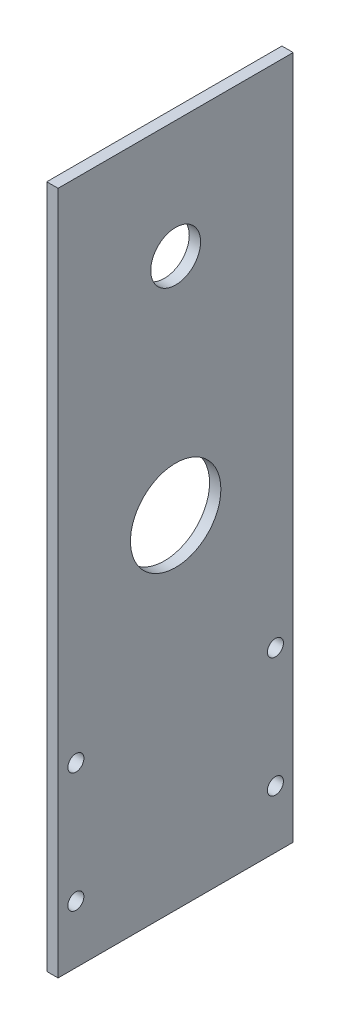
ISO-10303-21;
HEADER;
FILE_DESCRIPTION(('STEP AP214'),'2;1');
FILE_NAME('part.step','',(''),(''),'','','');
FILE_SCHEMA(('AUTOMOTIVE_DESIGN { 1 0 10303 214 1 1 1 1 }'));
ENDSEC;
DATA;
#1=APPLICATION_CONTEXT('core data for automotive mechanical design processes');
#2=APPLICATION_PROTOCOL_DEFINITION('international standard','automotive_design',2000,#1);
#3=PRODUCT_CONTEXT('',#1,'mechanical');
#4=PRODUCT('Part','Part','',(#3));
#5=PRODUCT_RELATED_PRODUCT_CATEGORY('part','',(#4));
#6=PRODUCT_DEFINITION_FORMATION('','',#4);
#7=PRODUCT_DEFINITION_CONTEXT('part definition',#1,'design');
#8=PRODUCT_DEFINITION('design','',#6,#7);
#9=PRODUCT_DEFINITION_SHAPE('','',#8);
#10=(LENGTH_UNIT() NAMED_UNIT(*) SI_UNIT(.MILLI.,.METRE.));
#11=(NAMED_UNIT(*) PLANE_ANGLE_UNIT() SI_UNIT($,.RADIAN.));
#12=(NAMED_UNIT(*) SI_UNIT($,.STERADIAN.) SOLID_ANGLE_UNIT());
#13=UNCERTAINTY_MEASURE_WITH_UNIT(LENGTH_MEASURE(1.E-05),#10,'distance_accuracy_value','');
#14=(GEOMETRIC_REPRESENTATION_CONTEXT(3) GLOBAL_UNCERTAINTY_ASSIGNED_CONTEXT((#13)) GLOBAL_UNIT_ASSIGNED_CONTEXT((#10,
#11,#12)) REPRESENTATION_CONTEXT('',''));
#15=CARTESIAN_POINT('',(0.,0.,0.));
#16=DIRECTION('',(0.,0.,1.));
#17=DIRECTION('',(1.,0.,0.));
#18=AXIS2_PLACEMENT_3D('',#15,#16,#17);
#19=CARTESIAN_POINT('',(3.175,-96.03994,0.));
#20=DIRECTION('',(0.,-1.,0.));
#21=DIRECTION('',(0.,0.,-1.));
#22=AXIS2_PLACEMENT_3D('',#19,#20,#21);
#23=PLANE('',#22);
#24=DIRECTION('',(0.,0.,1.));
#25=VECTOR('',#24,1.);
#26=CARTESIAN_POINT('',(0.,-96.03994,0.));
#27=LINE('',#26,#25);
#28=CARTESIAN_POINT('',(0.,-96.03994,-33.02));
#29=VERTEX_POINT('',#28);
#30=CARTESIAN_POINT('',(0.,-96.03994,33.02));
#31=VERTEX_POINT('',#30);
#32=EDGE_CURVE('E127',#29,#31,#27,.T.);
#33=ORIENTED_EDGE('',*,*,#32,.F.);
#34=DIRECTION('',(-1.,0.,0.));
#35=VECTOR('',#34,1.);
#36=CARTESIAN_POINT('',(3.175,-96.03994,-33.02));
#37=LINE('',#36,#35);
#38=CARTESIAN_POINT('',(3.175,-96.03994,-33.02));
#39=VERTEX_POINT('',#38);
#40=EDGE_CURVE('E11',#39,#29,#37,.T.);
#41=ORIENTED_EDGE('',*,*,#40,.F.);
#42=DIRECTION('',(0.,0.,1.));
#43=VECTOR('',#42,1.);
#44=CARTESIAN_POINT('',(3.175,-96.03994,0.));
#45=LINE('',#44,#43);
#46=CARTESIAN_POINT('',(3.175,-96.03994,33.02));
#47=VERTEX_POINT('',#46);
#48=EDGE_CURVE('E102',#39,#47,#45,.T.);
#49=ORIENTED_EDGE('',*,*,#48,.T.);
#50=DIRECTION('',(-1.,0.,0.));
#51=VECTOR('',#50,1.);
#52=CARTESIAN_POINT('',(3.175,-96.03994,33.02));
#53=LINE('',#52,#51);
#54=EDGE_CURVE('E81',#47,#31,#53,.T.);
#55=ORIENTED_EDGE('',*,*,#54,.T.);
#56=EDGE_LOOP('',(#33,#41,#49,#55));
#57=FACE_BOUND('',#56,.T.);
#58=ADVANCED_FACE('F41',(#57),#23,.T.);
#59=CARTESIAN_POINT('',(3.175,0.,-33.02));
#60=DIRECTION('',(0.,0.,-1.));
#61=DIRECTION('',(0.,1.,0.));
#62=AXIS2_PLACEMENT_3D('',#59,#60,#61);
#63=PLANE('',#62);
#64=DIRECTION('',(0.,-1.,0.));
#65=VECTOR('',#64,1.);
#66=CARTESIAN_POINT('',(0.,0.,-33.02));
#67=LINE('',#66,#65);
#68=CARTESIAN_POINT('',(0.,96.03994,-33.02));
#69=VERTEX_POINT('',#68);
#70=EDGE_CURVE('E93',#69,#29,#67,.T.);
#71=ORIENTED_EDGE('',*,*,#70,.F.);
#72=DIRECTION('',(-1.,0.,0.));
#73=VECTOR('',#72,1.);
#74=CARTESIAN_POINT('',(3.175,96.03994,-33.02));
#75=LINE('',#74,#73);
#76=CARTESIAN_POINT('',(3.175,96.03994,-33.02));
#77=VERTEX_POINT('',#76);
#78=EDGE_CURVE('E50',#77,#69,#75,.T.);
#79=ORIENTED_EDGE('',*,*,#78,.F.);
#80=DIRECTION('',(0.,-1.,0.));
#81=VECTOR('',#80,1.);
#82=CARTESIAN_POINT('',(3.175,0.,-33.02));
#83=LINE('',#82,#81);
#84=EDGE_CURVE('E91',#77,#39,#83,.T.);
#85=ORIENTED_EDGE('',*,*,#84,.T.);
#86=ORIENTED_EDGE('',*,*,#40,.T.);
#87=EDGE_LOOP('',(#71,#79,#85,#86));
#88=FACE_BOUND('',#87,.T.);
#89=ADVANCED_FACE('F89',(#88),#63,.T.);
#90=CARTESIAN_POINT('',(3.175,96.03994,0.));
#91=DIRECTION('',(0.,-1.,0.));
#92=DIRECTION('',(0.,0.,-1.));
#93=AXIS2_PLACEMENT_3D('',#90,#91,#92);
#94=PLANE('',#93);
#95=DIRECTION('',(0.,0.,1.));
#96=VECTOR('',#95,1.);
#97=CARTESIAN_POINT('',(0.,96.03994,0.));
#98=LINE('',#97,#96);
#99=CARTESIAN_POINT('',(0.,96.03994,33.02));
#100=VERTEX_POINT('',#99);
#101=EDGE_CURVE('E130',#69,#100,#98,.T.);
#102=ORIENTED_EDGE('',*,*,#101,.T.);
#103=DIRECTION('',(-1.,0.,0.));
#104=VECTOR('',#103,1.);
#105=CARTESIAN_POINT('',(3.175,96.03994,33.02));
#106=LINE('',#105,#104);
#107=CARTESIAN_POINT('',(3.175,96.03994,33.02));
#108=VERTEX_POINT('',#107);
#109=EDGE_CURVE('E96',#108,#100,#106,.T.);
#110=ORIENTED_EDGE('',*,*,#109,.F.);
#111=DIRECTION('',(0.,0.,1.));
#112=VECTOR('',#111,1.);
#113=CARTESIAN_POINT('',(3.175,96.03994,0.));
#114=LINE('',#113,#112);
#115=EDGE_CURVE('E98',#77,#108,#114,.T.);
#116=ORIENTED_EDGE('',*,*,#115,.F.);
#117=ORIENTED_EDGE('',*,*,#78,.T.);
#118=EDGE_LOOP('',(#102,#110,#116,#117));
#119=FACE_BOUND('',#118,.T.);
#120=ADVANCED_FACE('F99',(#119),#94,.F.);
#121=CARTESIAN_POINT('',(3.175,63.01994,0.));
#122=DIRECTION('',(-1.,0.,0.));
#123=DIRECTION('',(0.,0.,1.));
#124=AXIS2_PLACEMENT_3D('',#121,#122,#123);
#125=CYLINDRICAL_SURFACE('',#124,7.);
#126=CARTESIAN_POINT('',(3.175,63.01994,0.));
#127=DIRECTION('',(1.,0.,0.));
#128=DIRECTION('',(0.,0.,-1.));
#129=AXIS2_PLACEMENT_3D('',#126,#127,#128);
#130=CIRCLE('',#129,7.);
#131=CARTESIAN_POINT('',(3.175,63.01994,-7.));
#132=VERTEX_POINT('',#131);
#133=EDGE_CURVE('E104',#132,#132,#130,.T.);
#134=ORIENTED_EDGE('',*,*,#133,.T.);
#135=EDGE_LOOP('',(#134));
#136=FACE_BOUND('',#135,.T.);
#137=CARTESIAN_POINT('',(0.,63.01994,0.));
#138=DIRECTION('',(1.,0.,0.));
#139=DIRECTION('',(0.,0.,-1.));
#140=AXIS2_PLACEMENT_3D('',#137,#138,#139);
#141=CIRCLE('',#140,7.);
#142=CARTESIAN_POINT('',(0.,63.01994,-7.));
#143=VERTEX_POINT('',#142);
#144=EDGE_CURVE('E124',#143,#143,#141,.T.);
#145=ORIENTED_EDGE('',*,*,#144,.F.);
#146=EDGE_LOOP('',(#145));
#147=FACE_BOUND('',#146,.T.);
#148=ADVANCED_FACE('F146',(#136,#147),#125,.F.);
#149=CARTESIAN_POINT('',(3.175,0.,0.));
#150=DIRECTION('',(-1.,0.,0.));
#151=DIRECTION('',(0.,0.,1.));
#152=AXIS2_PLACEMENT_3D('',#149,#150,#151);
#153=CYLINDRICAL_SURFACE('',#152,12.7);
#154=CARTESIAN_POINT('',(3.175,0.,0.));
#155=DIRECTION('',(1.,0.,0.));
#156=DIRECTION('',(0.,0.,-1.));
#157=AXIS2_PLACEMENT_3D('',#154,#155,#156);
#158=CIRCLE('',#157,12.7);
#159=CARTESIAN_POINT('',(3.175,0.,-12.7));
#160=VERTEX_POINT('',#159);
#161=EDGE_CURVE('E283',#160,#160,#158,.T.);
#162=ORIENTED_EDGE('',*,*,#161,.T.);
#163=EDGE_LOOP('',(#162));
#164=FACE_BOUND('',#163,.T.);
#165=CARTESIAN_POINT('',(0.,0.,0.));
#166=DIRECTION('',(1.,0.,0.));
#167=DIRECTION('',(0.,0.,-1.));
#168=AXIS2_PLACEMENT_3D('',#165,#166,#167);
#169=CIRCLE('',#168,12.7);
#170=CARTESIAN_POINT('',(0.,0.,-12.7));
#171=VERTEX_POINT('',#170);
#172=EDGE_CURVE('E121',#171,#171,#169,.T.);
#173=ORIENTED_EDGE('',*,*,#172,.F.);
#174=EDGE_LOOP('',(#173));
#175=FACE_BOUND('',#174,.T.);
#176=ADVANCED_FACE('F149',(#164,#175),#153,.F.);
#177=CARTESIAN_POINT('',(3.175,-79.831946,28.02001));
#178=DIRECTION('',(-1.,0.,0.));
#179=DIRECTION('',(0.,0.,1.));
#180=AXIS2_PLACEMENT_3D('',#177,#178,#179);
#181=CYLINDRICAL_SURFACE('',#180,2.25);
#182=CARTESIAN_POINT('',(3.175,-79.831946,28.02001));
#183=DIRECTION('',(1.,0.,0.));
#184=DIRECTION('',(0.,0.,-1.));
#185=AXIS2_PLACEMENT_3D('',#182,#183,#184);
#186=CIRCLE('',#185,2.25);
#187=CARTESIAN_POINT('',(3.175,-79.831946,25.77001));
#188=VERTEX_POINT('',#187);
#189=EDGE_CURVE('E279',#188,#188,#186,.T.);
#190=ORIENTED_EDGE('',*,*,#189,.T.);
#191=EDGE_LOOP('',(#190));
#192=FACE_BOUND('',#191,.T.);
#193=CARTESIAN_POINT('',(0.,-79.831946,28.02001));
#194=DIRECTION('',(1.,0.,0.));
#195=DIRECTION('',(0.,0.,-1.));
#196=AXIS2_PLACEMENT_3D('',#193,#194,#195);
#197=CIRCLE('',#196,2.25);
#198=CARTESIAN_POINT('',(0.,-79.831946,25.77001));
#199=VERTEX_POINT('',#198);
#200=EDGE_CURVE('E118',#199,#199,#197,.T.);
#201=ORIENTED_EDGE('',*,*,#200,.F.);
#202=EDGE_LOOP('',(#201));
#203=FACE_BOUND('',#202,.T.);
#204=ADVANCED_FACE('F153',(#192,#203),#181,.F.);
#205=CARTESIAN_POINT('',(3.175,-79.831946,-28.02001));
#206=DIRECTION('',(-1.,0.,0.));
#207=DIRECTION('',(0.,0.,1.));
#208=AXIS2_PLACEMENT_3D('',#205,#206,#207);
#209=CYLINDRICAL_SURFACE('',#208,2.25);
#210=CARTESIAN_POINT('',(3.175,-79.831946,-28.02001));
#211=DIRECTION('',(1.,0.,0.));
#212=DIRECTION('',(0.,0.,-1.));
#213=AXIS2_PLACEMENT_3D('',#210,#211,#212);
#214=CIRCLE('',#213,2.25);
#215=CARTESIAN_POINT('',(3.175,-79.831946,-30.27001));
#216=VERTEX_POINT('',#215);
#217=EDGE_CURVE('E275',#216,#216,#214,.T.);
#218=ORIENTED_EDGE('',*,*,#217,.T.);
#219=EDGE_LOOP('',(#218));
#220=FACE_BOUND('',#219,.T.);
#221=CARTESIAN_POINT('',(0.,-79.831946,-28.02001));
#222=DIRECTION('',(1.,0.,0.));
#223=DIRECTION('',(0.,0.,-1.));
#224=AXIS2_PLACEMENT_3D('',#221,#222,#223);
#225=CIRCLE('',#224,2.25);
#226=CARTESIAN_POINT('',(0.,-79.831946,-30.27001));
#227=VERTEX_POINT('',#226);
#228=EDGE_CURVE('E115',#227,#227,#225,.T.);
#229=ORIENTED_EDGE('',*,*,#228,.F.);
#230=EDGE_LOOP('',(#229));
#231=FACE_BOUND('',#230,.T.);
#232=ADVANCED_FACE('F157',(#220,#231),#209,.F.);
#233=CARTESIAN_POINT('',(3.175,-46.207934,-28.02001));
#234=DIRECTION('',(-1.,0.,0.));
#235=DIRECTION('',(0.,0.,1.));
#236=AXIS2_PLACEMENT_3D('',#233,#234,#235);
#237=CYLINDRICAL_SURFACE('',#236,2.25);
#238=CARTESIAN_POINT('',(3.175,-46.207934,-28.02001));
#239=DIRECTION('',(1.,0.,0.));
#240=DIRECTION('',(0.,0.,-1.));
#241=AXIS2_PLACEMENT_3D('',#238,#239,#240);
#242=CIRCLE('',#241,2.25);
#243=CARTESIAN_POINT('',(3.175,-46.207934,-30.27001));
#244=VERTEX_POINT('',#243);
#245=EDGE_CURVE('E171',#244,#244,#242,.T.);
#246=ORIENTED_EDGE('',*,*,#245,.T.);
#247=EDGE_LOOP('',(#246));
#248=FACE_BOUND('',#247,.T.);
#249=CARTESIAN_POINT('',(0.,-46.207934,-28.02001));
#250=DIRECTION('',(1.,0.,0.));
#251=DIRECTION('',(0.,0.,-1.));
#252=AXIS2_PLACEMENT_3D('',#249,#250,#251);
#253=CIRCLE('',#252,2.25);
#254=CARTESIAN_POINT('',(0.,-46.207934,-30.27001));
#255=VERTEX_POINT('',#254);
#256=EDGE_CURVE('E112',#255,#255,#253,.T.);
#257=ORIENTED_EDGE('',*,*,#256,.F.);
#258=EDGE_LOOP('',(#257));
#259=FACE_BOUND('',#258,.T.);
#260=ADVANCED_FACE('F160',(#248,#259),#237,.F.);
#261=CARTESIAN_POINT('',(3.175,-46.207934,28.02001));
#262=DIRECTION('',(-1.,0.,0.));
#263=DIRECTION('',(0.,0.,1.));
#264=AXIS2_PLACEMENT_3D('',#261,#262,#263);
#265=CYLINDRICAL_SURFACE('',#264,2.25);
#266=CARTESIAN_POINT('',(3.175,-46.207934,28.02001));
#267=DIRECTION('',(1.,0.,0.));
#268=DIRECTION('',(0.,0.,-1.));
#269=AXIS2_PLACEMENT_3D('',#266,#267,#268);
#270=CIRCLE('',#269,2.25);
#271=CARTESIAN_POINT('',(3.175,-46.207934,25.77001));
#272=VERTEX_POINT('',#271);
#273=EDGE_CURVE('E133',#272,#272,#270,.T.);
#274=ORIENTED_EDGE('',*,*,#273,.T.);
#275=EDGE_LOOP('',(#274));
#276=FACE_BOUND('',#275,.T.);
#277=CARTESIAN_POINT('',(0.,-46.207934,28.02001));
#278=DIRECTION('',(1.,0.,0.));
#279=DIRECTION('',(0.,0.,-1.));
#280=AXIS2_PLACEMENT_3D('',#277,#278,#279);
#281=CIRCLE('',#280,2.25);
#282=CARTESIAN_POINT('',(0.,-46.207934,25.77001));
#283=VERTEX_POINT('',#282);
#284=EDGE_CURVE('E109',#283,#283,#281,.T.);
#285=ORIENTED_EDGE('',*,*,#284,.F.);
#286=EDGE_LOOP('',(#285));
#287=FACE_BOUND('',#286,.T.);
#288=ADVANCED_FACE('F43',(#276,#287),#265,.F.);
#289=CARTESIAN_POINT('',(3.175,0.,33.02));
#290=DIRECTION('',(0.,0.,-1.));
#291=DIRECTION('',(0.,1.,0.));
#292=AXIS2_PLACEMENT_3D('',#289,#290,#291);
#293=PLANE('',#292);
#294=DIRECTION('',(0.,-1.,0.));
#295=VECTOR('',#294,1.);
#296=CARTESIAN_POINT('',(0.,0.,33.02));
#297=LINE('',#296,#295);
#298=EDGE_CURVE('E74',#100,#31,#297,.T.);
#299=ORIENTED_EDGE('',*,*,#298,.T.);
#300=ORIENTED_EDGE('',*,*,#54,.F.);
#301=DIRECTION('',(0.,-1.,0.));
#302=VECTOR('',#301,1.);
#303=CARTESIAN_POINT('',(3.175,0.,33.02));
#304=LINE('',#303,#302);
#305=EDGE_CURVE('E58',#108,#47,#304,.T.);
#306=ORIENTED_EDGE('',*,*,#305,.F.);
#307=ORIENTED_EDGE('',*,*,#109,.T.);
#308=EDGE_LOOP('',(#299,#300,#306,#307));
#309=FACE_BOUND('',#308,.T.);
#310=ADVANCED_FACE('F136',(#309),#293,.F.);
#311=CARTESIAN_POINT('',(3.175,0.,0.));
#312=DIRECTION('',(1.,0.,0.));
#313=DIRECTION('',(0.,0.,-1.));
#314=AXIS2_PLACEMENT_3D('',#311,#312,#313);
#315=PLANE('',#314);
#316=ORIENTED_EDGE('',*,*,#273,.F.);
#317=EDGE_LOOP('',(#316));
#318=FACE_BOUND('',#317,.T.);
#319=ORIENTED_EDGE('',*,*,#245,.F.);
#320=EDGE_LOOP('',(#319));
#321=FACE_BOUND('',#320,.T.);
#322=ORIENTED_EDGE('',*,*,#217,.F.);
#323=EDGE_LOOP('',(#322));
#324=FACE_BOUND('',#323,.T.);
#325=ORIENTED_EDGE('',*,*,#189,.F.);
#326=EDGE_LOOP('',(#325));
#327=FACE_BOUND('',#326,.T.);
#328=ORIENTED_EDGE('',*,*,#161,.F.);
#329=EDGE_LOOP('',(#328));
#330=FACE_BOUND('',#329,.T.);
#331=ORIENTED_EDGE('',*,*,#133,.F.);
#332=EDGE_LOOP('',(#331));
#333=FACE_BOUND('',#332,.T.);
#334=ORIENTED_EDGE('',*,*,#48,.F.);
#335=ORIENTED_EDGE('',*,*,#84,.F.);
#336=ORIENTED_EDGE('',*,*,#115,.T.);
#337=ORIENTED_EDGE('',*,*,#305,.T.);
#338=EDGE_LOOP('',(#334,#335,#336,#337));
#339=FACE_BOUND('',#338,.T.);
#340=ADVANCED_FACE('F101',(#318,#321,#324,#327,#330,#333,#339),#315,.T.);
#341=CARTESIAN_POINT('',(0.,0.,0.));
#342=DIRECTION('',(1.,0.,0.));
#343=DIRECTION('',(0.,0.,-1.));
#344=AXIS2_PLACEMENT_3D('',#341,#342,#343);
#345=PLANE('',#344);
#346=ORIENTED_EDGE('',*,*,#284,.T.);
#347=EDGE_LOOP('',(#346));
#348=FACE_BOUND('',#347,.T.);
#349=ORIENTED_EDGE('',*,*,#256,.T.);
#350=EDGE_LOOP('',(#349));
#351=FACE_BOUND('',#350,.T.);
#352=ORIENTED_EDGE('',*,*,#228,.T.);
#353=EDGE_LOOP('',(#352));
#354=FACE_BOUND('',#353,.T.);
#355=ORIENTED_EDGE('',*,*,#200,.T.);
#356=EDGE_LOOP('',(#355));
#357=FACE_BOUND('',#356,.T.);
#358=ORIENTED_EDGE('',*,*,#172,.T.);
#359=EDGE_LOOP('',(#358));
#360=FACE_BOUND('',#359,.T.);
#361=ORIENTED_EDGE('',*,*,#144,.T.);
#362=EDGE_LOOP('',(#361));
#363=FACE_BOUND('',#362,.T.);
#364=ORIENTED_EDGE('',*,*,#32,.T.);
#365=ORIENTED_EDGE('',*,*,#298,.F.);
#366=ORIENTED_EDGE('',*,*,#101,.F.);
#367=ORIENTED_EDGE('',*,*,#70,.T.);
#368=EDGE_LOOP('',(#364,#365,#366,#367));
#369=FACE_BOUND('',#368,.T.);
#370=ADVANCED_FACE('F137',(#348,#351,#354,#357,#360,#363,#369),#345,.F.);
#371=CLOSED_SHELL('',(#58,#89,#120,#148,#176,#204,#232,#260,#288,#310,#340,#370));
#372=MANIFOLD_SOLID_BREP('B2',#371);
#373=ADVANCED_BREP_SHAPE_REPRESENTATION('',(#18,#372),#14);
#374=SHAPE_DEFINITION_REPRESENTATION(#9,#373);
ENDSEC;
END-ISO-10303-21;
